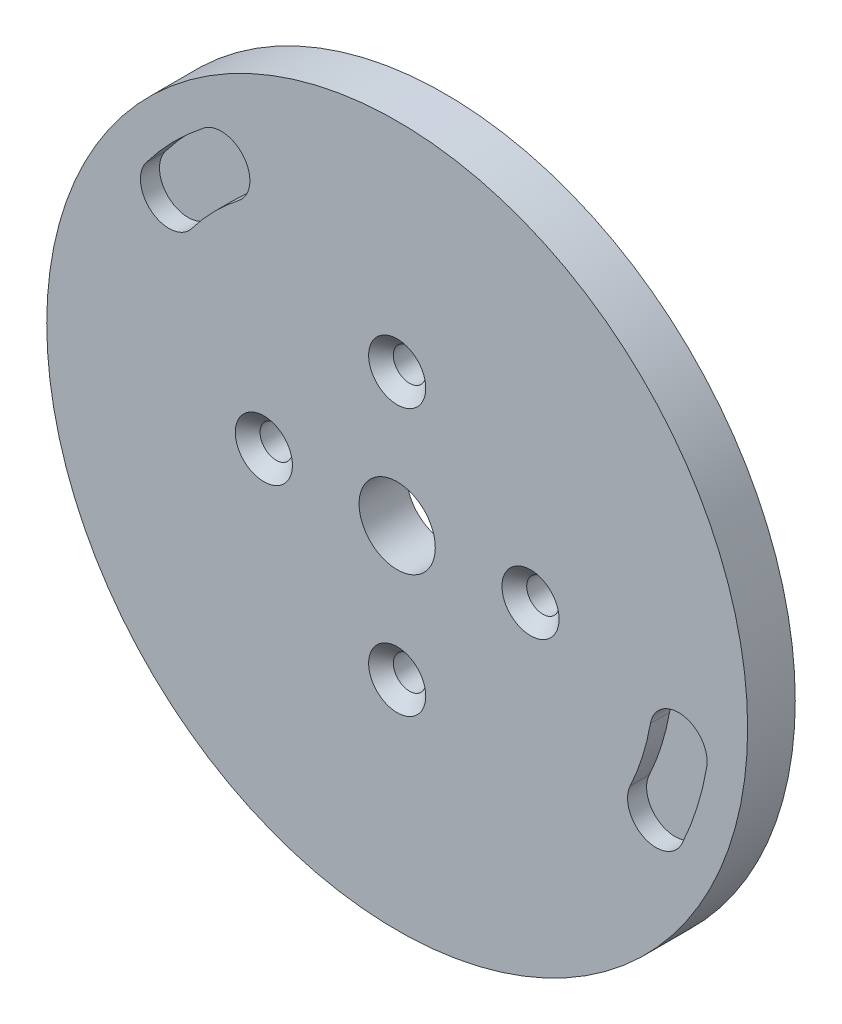
ISO-10303-21;
HEADER;
FILE_DESCRIPTION(('STEP AP214'),'2;1');
FILE_NAME('part.step','',(''),(''),'','','');
FILE_SCHEMA(('AUTOMOTIVE_DESIGN { 1 0 10303 214 1 1 1 1 }'));
ENDSEC;
DATA;
#1=APPLICATION_CONTEXT('core data for automotive mechanical design processes');
#2=APPLICATION_PROTOCOL_DEFINITION('international standard','automotive_design',2000,#1);
#3=PRODUCT_CONTEXT('',#1,'mechanical');
#4=PRODUCT('Part','Part','',(#3));
#5=PRODUCT_RELATED_PRODUCT_CATEGORY('part','',(#4));
#6=PRODUCT_DEFINITION_FORMATION('','',#4);
#7=PRODUCT_DEFINITION_CONTEXT('part definition',#1,'design');
#8=PRODUCT_DEFINITION('design','',#6,#7);
#9=PRODUCT_DEFINITION_SHAPE('','',#8);
#10=(LENGTH_UNIT() NAMED_UNIT(*) SI_UNIT(.MILLI.,.METRE.));
#11=(NAMED_UNIT(*) PLANE_ANGLE_UNIT() SI_UNIT($,.RADIAN.));
#12=(NAMED_UNIT(*) SI_UNIT($,.STERADIAN.) SOLID_ANGLE_UNIT());
#13=UNCERTAINTY_MEASURE_WITH_UNIT(LENGTH_MEASURE(1.E-05),#10,'distance_accuracy_value','');
#14=(GEOMETRIC_REPRESENTATION_CONTEXT(3) GLOBAL_UNCERTAINTY_ASSIGNED_CONTEXT((#13)) GLOBAL_UNIT_ASSIGNED_CONTEXT((#10,
#11,#12)) REPRESENTATION_CONTEXT('',''));
#15=CARTESIAN_POINT('',(0.,0.,0.));
#16=DIRECTION('',(0.,0.,1.));
#17=DIRECTION('',(1.,0.,0.));
#18=AXIS2_PLACEMENT_3D('',#15,#16,#17);
#19=CARTESIAN_POINT('',(0.,0.,5.));
#20=DIRECTION('',(0.,0.,1.));
#21=DIRECTION('',(1.,0.,0.));
#22=AXIS2_PLACEMENT_3D('',#19,#20,#21);
#23=PLANE('',#22);
#24=CARTESIAN_POINT('',(0.,14.,5.));
#25=DIRECTION('',(0.,0.,1.));
#26=DIRECTION('',(1.,0.,0.));
#27=AXIS2_PLACEMENT_3D('',#24,#25,#26);
#28=CIRCLE('',#27,3.);
#29=CARTESIAN_POINT('',(3.,14.,5.));
#30=VERTEX_POINT('',#29);
#31=EDGE_CURVE('E309',#30,#30,#28,.T.);
#32=ORIENTED_EDGE('',*,*,#31,.F.);
#33=EDGE_LOOP('',(#32));
#34=FACE_BOUND('',#33,.T.);
#35=CARTESIAN_POINT('',(14.,0.,5.));
#36=DIRECTION('',(0.,0.,1.));
#37=DIRECTION('',(1.,0.,0.));
#38=AXIS2_PLACEMENT_3D('',#35,#36,#37);
#39=CIRCLE('',#38,3.);
#40=CARTESIAN_POINT('',(17.,0.,5.));
#41=VERTEX_POINT('',#40);
#42=EDGE_CURVE('E237',#41,#41,#39,.T.);
#43=ORIENTED_EDGE('',*,*,#42,.F.);
#44=EDGE_LOOP('',(#43));
#45=FACE_BOUND('',#44,.T.);
#46=CARTESIAN_POINT('',(0.,-14.,5.));
#47=DIRECTION('',(0.,0.,1.));
#48=DIRECTION('',(1.,0.,0.));
#49=AXIS2_PLACEMENT_3D('',#46,#47,#48);
#50=CIRCLE('',#49,3.);
#51=CARTESIAN_POINT('',(3.,-14.,5.));
#52=VERTEX_POINT('',#51);
#53=EDGE_CURVE('E228',#52,#52,#50,.T.);
#54=ORIENTED_EDGE('',*,*,#53,.F.);
#55=EDGE_LOOP('',(#54));
#56=FACE_BOUND('',#55,.T.);
#57=CARTESIAN_POINT('',(-14.,0.,5.));
#58=DIRECTION('',(0.,0.,1.));
#59=DIRECTION('',(1.,0.,0.));
#60=AXIS2_PLACEMENT_3D('',#57,#58,#59);
#61=CIRCLE('',#60,3.);
#62=CARTESIAN_POINT('',(-11.,0.,5.));
#63=VERTEX_POINT('',#62);
#64=EDGE_CURVE('E223',#63,#63,#61,.T.);
#65=ORIENTED_EDGE('',*,*,#64,.F.);
#66=EDGE_LOOP('',(#65));
#67=FACE_BOUND('',#66,.T.);
#68=CARTESIAN_POINT('',(29.5442325903662,-5.20944533000793,5.));
#69=DIRECTION('',(0.,0.,1.));
#70=DIRECTION('',(1.,0.,0.));
#71=AXIS2_PLACEMENT_3D('',#68,#69,#70);
#72=CIRCLE('',#71,3.);
#73=CARTESIAN_POINT('',(32.4986558494029,-5.73038986300873,5.));
#74=VERTEX_POINT('',#73);
#75=CARTESIAN_POINT('',(26.5898093313296,-4.68850079700714,5.));
#76=VERTEX_POINT('',#75);
#77=EDGE_CURVE('E68',#74,#76,#72,.T.);
#78=ORIENTED_EDGE('',*,*,#77,.F.);
#79=CARTESIAN_POINT('',(0.,0.,5.));
#80=DIRECTION('',(0.,0.,1.));
#81=DIRECTION('',(1.,0.,0.));
#82=AXIS2_PLACEMENT_3D('',#79,#80,#81);
#83=CIRCLE('',#82,33.);
#84=CARTESIAN_POINT('',(29.9081569722092,-13.9464026374436,5.));
#85=VERTEX_POINT('',#84);
#86=EDGE_CURVE('E169',#85,#74,#83,.T.);
#87=ORIENTED_EDGE('',*,*,#86,.F.);
#88=CARTESIAN_POINT('',(27.1892336110993,-12.6785478522214,5.));
#89=DIRECTION('',(0.,0.,1.));
#90=DIRECTION('',(1.,0.,0.));
#91=AXIS2_PLACEMENT_3D('',#88,#89,#90);
#92=CIRCLE('',#91,3.);
#93=CARTESIAN_POINT('',(24.4703102499894,-11.4106930669993,5.));
#94=VERTEX_POINT('',#93);
#95=EDGE_CURVE('E188',#94,#85,#92,.T.);
#96=ORIENTED_EDGE('',*,*,#95,.F.);
#97=CARTESIAN_POINT('',(0.,0.,5.));
#98=DIRECTION('',(0.,0.,-1.));
#99=DIRECTION('',(1.,0.,0.));
#100=AXIS2_PLACEMENT_3D('',#97,#98,#99);
#101=CIRCLE('',#100,27.);
#102=EDGE_CURVE('E184',#76,#94,#101,.T.);
#103=ORIENTED_EDGE('',*,*,#102,.F.);
#104=EDGE_LOOP('',(#78,#87,#96,#103));
#105=FACE_BOUND('',#104,.T.);
#106=CARTESIAN_POINT('',(0.,0.,5.));
#107=DIRECTION('',(0.,0.,1.));
#108=DIRECTION('',(1.,0.,0.));
#109=AXIS2_PLACEMENT_3D('',#106,#107,#108);
#110=CIRCLE('',#109,4.);
#111=CARTESIAN_POINT('',(4.,0.,5.));
#112=VERTEX_POINT('',#111);
#113=EDGE_CURVE('E198',#112,#112,#110,.T.);
#114=ORIENTED_EDGE('',*,*,#113,.F.);
#115=EDGE_LOOP('',(#114));
#116=FACE_BOUND('',#115,.T.);
#117=CARTESIAN_POINT('',(0.,0.,5.));
#118=DIRECTION('',(0.,0.,1.));
#119=DIRECTION('',(1.,0.,0.));
#120=AXIS2_PLACEMENT_3D('',#117,#118,#119);
#121=CIRCLE('',#120,36.8);
#122=CARTESIAN_POINT('',(36.8,0.,5.));
#123=VERTEX_POINT('',#122);
#124=EDGE_CURVE('E11',#123,#123,#121,.T.);
#125=ORIENTED_EDGE('',*,*,#124,.T.);
#126=EDGE_LOOP('',(#125));
#127=FACE_BOUND('',#126,.T.);
#128=CARTESIAN_POINT('',(-23.959065301419,18.0544506945612,5.));
#129=DIRECTION('',(0.,0.,1.));
#130=DIRECTION('',(1.,0.,0.));
#131=AXIS2_PLACEMENT_3D('',#128,#129,#130);
#132=CIRCLE('',#131,3.);
#133=CARTESIAN_POINT('',(-26.3549718315609,19.8598957640173,5.));
#134=VERTEX_POINT('',#133);
#135=CARTESIAN_POINT('',(-21.5631587712771,16.2490056251051,5.));
#136=VERTEX_POINT('',#135);
#137=EDGE_CURVE('E60',#134,#136,#132,.T.);
#138=ORIENTED_EDGE('',*,*,#137,.F.);
#139=CARTESIAN_POINT('',(0.,0.,5.));
#140=DIRECTION('',(0.,0.,1.));
#141=DIRECTION('',(1.,0.,0.));
#142=AXIS2_PLACEMENT_3D('',#139,#140,#141);
#143=CIRCLE('',#142,33.);
#144=CARTESIAN_POINT('',(-20.3168286857469,26.0043548690217,5.));
#145=VERTEX_POINT('',#144);
#146=EDGE_CURVE('E133',#145,#134,#143,.T.);
#147=ORIENTED_EDGE('',*,*,#146,.F.);
#148=CARTESIAN_POINT('',(-18.4698442597699,23.6403226082016,5.));
#149=DIRECTION('',(0.,0.,1.));
#150=DIRECTION('',(1.,0.,0.));
#151=AXIS2_PLACEMENT_3D('',#148,#149,#150);
#152=CIRCLE('',#151,3.);
#153=CARTESIAN_POINT('',(-16.6228598337929,21.2762903473814,5.));
#154=VERTEX_POINT('',#153);
#155=EDGE_CURVE('E137',#154,#145,#152,.T.);
#156=ORIENTED_EDGE('',*,*,#155,.F.);
#157=CARTESIAN_POINT('',(0.,0.,5.));
#158=DIRECTION('',(0.,0.,-1.));
#159=DIRECTION('',(1.,0.,0.));
#160=AXIS2_PLACEMENT_3D('',#157,#158,#159);
#161=CIRCLE('',#160,27.);
#162=EDGE_CURVE('E149',#136,#154,#161,.T.);
#163=ORIENTED_EDGE('',*,*,#162,.F.);
#164=EDGE_LOOP('',(#138,#147,#156,#163));
#165=FACE_BOUND('',#164,.T.);
#166=ADVANCED_FACE('F42',(#34,#45,#56,#67,#105,#116,#127,#165),#23,.T.);
#167=CARTESIAN_POINT('',(0.,0.,5.));
#168=DIRECTION('',(0.,0.,-1.));
#169=DIRECTION('',(-1.,0.,0.));
#170=AXIS2_PLACEMENT_3D('',#167,#168,#169);
#171=CYLINDRICAL_SURFACE('',#170,36.8);
#172=ORIENTED_EDGE('',*,*,#124,.F.);
#173=EDGE_LOOP('',(#172));
#174=FACE_BOUND('',#173,.T.);
#175=CARTESIAN_POINT('',(0.,0.,0.));
#176=DIRECTION('',(0.,0.,1.));
#177=DIRECTION('',(1.,0.,0.));
#178=AXIS2_PLACEMENT_3D('',#175,#176,#177);
#179=CIRCLE('',#178,36.8);
#180=CARTESIAN_POINT('',(36.8,0.,0.));
#181=VERTEX_POINT('',#180);
#182=EDGE_CURVE('E52',#181,#181,#179,.T.);
#183=ORIENTED_EDGE('',*,*,#182,.T.);
#184=EDGE_LOOP('',(#183));
#185=FACE_BOUND('',#184,.T.);
#186=ADVANCED_FACE('F44',(#174,#185),#171,.T.);
#187=CARTESIAN_POINT('',(0.,0.,0.));
#188=DIRECTION('',(0.,0.,1.));
#189=DIRECTION('',(1.,0.,0.));
#190=AXIS2_PLACEMENT_3D('',#187,#188,#189);
#191=PLANE('',#190);
#192=CARTESIAN_POINT('',(0.,14.,0.));
#193=DIRECTION('',(0.,0.,1.));
#194=DIRECTION('',(1.,0.,0.));
#195=AXIS2_PLACEMENT_3D('',#192,#193,#194);
#196=CIRCLE('',#195,1.7);
#197=CARTESIAN_POINT('',(1.7,14.,0.));
#198=VERTEX_POINT('',#197);
#199=EDGE_CURVE('E46',#198,#198,#196,.T.);
#200=ORIENTED_EDGE('',*,*,#199,.T.);
#201=EDGE_LOOP('',(#200));
#202=FACE_BOUND('',#201,.T.);
#203=CARTESIAN_POINT('',(14.,0.,0.));
#204=DIRECTION('',(0.,0.,1.));
#205=DIRECTION('',(1.,0.,0.));
#206=AXIS2_PLACEMENT_3D('',#203,#204,#205);
#207=CIRCLE('',#206,1.7);
#208=CARTESIAN_POINT('',(15.7,0.,0.));
#209=VERTEX_POINT('',#208);
#210=EDGE_CURVE('E225',#209,#209,#207,.T.);
#211=ORIENTED_EDGE('',*,*,#210,.T.);
#212=EDGE_LOOP('',(#211));
#213=FACE_BOUND('',#212,.T.);
#214=CARTESIAN_POINT('',(0.,-14.,0.));
#215=DIRECTION('',(0.,0.,1.));
#216=DIRECTION('',(1.,0.,0.));
#217=AXIS2_PLACEMENT_3D('',#214,#215,#216);
#218=CIRCLE('',#217,1.7);
#219=CARTESIAN_POINT('',(1.7,-14.,0.));
#220=VERTEX_POINT('',#219);
#221=EDGE_CURVE('E220',#220,#220,#218,.T.);
#222=ORIENTED_EDGE('',*,*,#221,.T.);
#223=EDGE_LOOP('',(#222));
#224=FACE_BOUND('',#223,.T.);
#225=CARTESIAN_POINT('',(-14.,0.,0.));
#226=DIRECTION('',(0.,0.,1.));
#227=DIRECTION('',(1.,0.,0.));
#228=AXIS2_PLACEMENT_3D('',#225,#226,#227);
#229=CIRCLE('',#228,1.7);
#230=CARTESIAN_POINT('',(-12.3,0.,0.));
#231=VERTEX_POINT('',#230);
#232=EDGE_CURVE('E150',#231,#231,#229,.T.);
#233=ORIENTED_EDGE('',*,*,#232,.T.);
#234=EDGE_LOOP('',(#233));
#235=FACE_BOUND('',#234,.T.);
#236=CARTESIAN_POINT('',(0.,0.,0.));
#237=DIRECTION('',(0.,0.,1.));
#238=DIRECTION('',(1.,0.,0.));
#239=AXIS2_PLACEMENT_3D('',#236,#237,#238);
#240=CIRCLE('',#239,4.);
#241=CARTESIAN_POINT('',(4.,0.,0.));
#242=VERTEX_POINT('',#241);
#243=EDGE_CURVE('E210',#242,#242,#240,.F.);
#244=ORIENTED_EDGE('',*,*,#243,.F.);
#245=EDGE_LOOP('',(#244));
#246=FACE_BOUND('',#245,.T.);
#247=ORIENTED_EDGE('',*,*,#182,.F.);
#248=EDGE_LOOP('',(#247));
#249=FACE_BOUND('',#248,.T.);
#250=ADVANCED_FACE('F277',(#202,#213,#224,#235,#246,#249),#191,.F.);
#251=CARTESIAN_POINT('',(0.,0.,-0.00100000000000013));
#252=DIRECTION('',(0.,0.,1.));
#253=DIRECTION('',(1.,0.,0.));
#254=AXIS2_PLACEMENT_3D('',#251,#252,#253);
#255=CYLINDRICAL_SURFACE('',#254,4.);
#256=ORIENTED_EDGE('',*,*,#113,.T.);
#257=EDGE_LOOP('',(#256));
#258=FACE_BOUND('',#257,.T.);
#259=ORIENTED_EDGE('',*,*,#243,.T.);
#260=EDGE_LOOP('',(#259));
#261=FACE_BOUND('',#260,.T.);
#262=ADVANCED_FACE('F282',(#258,#261),#255,.F.);
#263=CARTESIAN_POINT('',(29.5442325903662,-5.20944533000793,3.));
#264=DIRECTION('',(0.,0.,1.));
#265=DIRECTION('',(1.,0.,0.));
#266=AXIS2_PLACEMENT_3D('',#263,#264,#265);
#267=CYLINDRICAL_SURFACE('',#266,3.);
#268=ORIENTED_EDGE('',*,*,#77,.T.);
#269=DIRECTION('',(0.,0.,1.));
#270=VECTOR('',#269,1.);
#271=CARTESIAN_POINT('',(26.5898093313296,-4.68850079700714,3.));
#272=LINE('',#271,#270);
#273=CARTESIAN_POINT('',(26.5898093313296,-4.68850079700714,3.));
#274=VERTEX_POINT('',#273);
#275=EDGE_CURVE('E181',#274,#76,#272,.T.);
#276=ORIENTED_EDGE('',*,*,#275,.F.);
#277=CARTESIAN_POINT('',(29.5442325903662,-5.20944533000793,3.));
#278=DIRECTION('',(0.,0.,1.));
#279=DIRECTION('',(1.,0.,0.));
#280=AXIS2_PLACEMENT_3D('',#277,#278,#279);
#281=CIRCLE('',#280,3.);
#282=CARTESIAN_POINT('',(32.4986558494029,-5.73038986300873,3.));
#283=VERTEX_POINT('',#282);
#284=EDGE_CURVE('E164',#283,#274,#281,.T.);
#285=ORIENTED_EDGE('',*,*,#284,.F.);
#286=DIRECTION('',(0.,0.,1.));
#287=VECTOR('',#286,1.);
#288=CARTESIAN_POINT('',(32.4986558494029,-5.73038986300873,3.));
#289=LINE('',#288,#287);
#290=EDGE_CURVE('E195',#283,#74,#289,.T.);
#291=ORIENTED_EDGE('',*,*,#290,.T.);
#292=EDGE_LOOP('',(#268,#276,#285,#291));
#293=FACE_BOUND('',#292,.T.);
#294=ADVANCED_FACE('F289',(#293),#267,.F.);
#295=CARTESIAN_POINT('',(0.,0.,3.));
#296=DIRECTION('',(0.,0.,1.));
#297=DIRECTION('',(1.,0.,0.));
#298=AXIS2_PLACEMENT_3D('',#295,#296,#297);
#299=CYLINDRICAL_SURFACE('',#298,33.);
#300=ORIENTED_EDGE('',*,*,#86,.T.);
#301=ORIENTED_EDGE('',*,*,#290,.F.);
#302=CARTESIAN_POINT('',(0.,0.,3.));
#303=DIRECTION('',(0.,0.,1.));
#304=DIRECTION('',(1.,0.,0.));
#305=AXIS2_PLACEMENT_3D('',#302,#303,#304);
#306=CIRCLE('',#305,33.);
#307=CARTESIAN_POINT('',(29.9081569722092,-13.9464026374436,3.));
#308=VERTEX_POINT('',#307);
#309=EDGE_CURVE('E177',#308,#283,#306,.T.);
#310=ORIENTED_EDGE('',*,*,#309,.F.);
#311=DIRECTION('',(0.,0.,1.));
#312=VECTOR('',#311,1.);
#313=CARTESIAN_POINT('',(29.9081569722092,-13.9464026374436,3.));
#314=LINE('',#313,#312);
#315=EDGE_CURVE('E199',#308,#85,#314,.T.);
#316=ORIENTED_EDGE('',*,*,#315,.T.);
#317=EDGE_LOOP('',(#300,#301,#310,#316));
#318=FACE_BOUND('',#317,.T.);
#319=ADVANCED_FACE('F373',(#318),#299,.F.);
#320=CARTESIAN_POINT('',(27.1892336110993,-12.6785478522214,3.));
#321=DIRECTION('',(0.,0.,1.));
#322=DIRECTION('',(1.,0.,0.));
#323=AXIS2_PLACEMENT_3D('',#320,#321,#322);
#324=CYLINDRICAL_SURFACE('',#323,3.);
#325=ORIENTED_EDGE('',*,*,#95,.T.);
#326=ORIENTED_EDGE('',*,*,#315,.F.);
#327=CARTESIAN_POINT('',(27.1892336110993,-12.6785478522214,3.));
#328=DIRECTION('',(0.,0.,1.));
#329=DIRECTION('',(1.,0.,0.));
#330=AXIS2_PLACEMENT_3D('',#327,#328,#329);
#331=CIRCLE('',#330,3.);
#332=CARTESIAN_POINT('',(24.4703102499894,-11.4106930669993,3.));
#333=VERTEX_POINT('',#332);
#334=EDGE_CURVE('E173',#333,#308,#331,.T.);
#335=ORIENTED_EDGE('',*,*,#334,.F.);
#336=DIRECTION('',(0.,0.,1.));
#337=VECTOR('',#336,1.);
#338=CARTESIAN_POINT('',(24.4703102499894,-11.4106930669993,3.));
#339=LINE('',#338,#337);
#340=EDGE_CURVE('E202',#333,#94,#339,.T.);
#341=ORIENTED_EDGE('',*,*,#340,.T.);
#342=EDGE_LOOP('',(#325,#326,#335,#341));
#343=FACE_BOUND('',#342,.T.);
#344=ADVANCED_FACE('F376',(#343),#324,.F.);
#345=CARTESIAN_POINT('',(0.,0.,3.));
#346=DIRECTION('',(0.,0.,1.));
#347=DIRECTION('',(1.,0.,0.));
#348=AXIS2_PLACEMENT_3D('',#345,#346,#347);
#349=CYLINDRICAL_SURFACE('',#348,27.);
#350=ORIENTED_EDGE('',*,*,#102,.T.);
#351=ORIENTED_EDGE('',*,*,#340,.F.);
#352=CARTESIAN_POINT('',(0.,0.,3.));
#353=DIRECTION('',(0.,0.,-1.));
#354=DIRECTION('',(1.,0.,0.));
#355=AXIS2_PLACEMENT_3D('',#352,#353,#354);
#356=CIRCLE('',#355,27.);
#357=EDGE_CURVE('E168',#274,#333,#356,.T.);
#358=ORIENTED_EDGE('',*,*,#357,.F.);
#359=ORIENTED_EDGE('',*,*,#275,.T.);
#360=EDGE_LOOP('',(#350,#351,#358,#359));
#361=FACE_BOUND('',#360,.T.);
#362=ADVANCED_FACE('F371',(#361),#349,.T.);
#363=CARTESIAN_POINT('',(14.7721162951831,-2.60472266500397,3.));
#364=DIRECTION('',(0.,0.,1.));
#365=DIRECTION('',(1.,0.,0.));
#366=AXIS2_PLACEMENT_3D('',#363,#364,#365);
#367=PLANE('',#366);
#368=ORIENTED_EDGE('',*,*,#284,.T.);
#369=ORIENTED_EDGE('',*,*,#357,.T.);
#370=ORIENTED_EDGE('',*,*,#334,.T.);
#371=ORIENTED_EDGE('',*,*,#309,.T.);
#372=EDGE_LOOP('',(#368,#369,#370,#371));
#373=FACE_BOUND('',#372,.T.);
#374=ADVANCED_FACE('F363',(#373),#367,.T.);
#375=CARTESIAN_POINT('',(-23.959065301419,18.0544506945612,3.));
#376=DIRECTION('',(0.,0.,1.));
#377=DIRECTION('',(1.,0.,0.));
#378=AXIS2_PLACEMENT_3D('',#375,#376,#377);
#379=CYLINDRICAL_SURFACE('',#378,3.);
#380=ORIENTED_EDGE('',*,*,#137,.T.);
#381=DIRECTION('',(0.,0.,1.));
#382=VECTOR('',#381,1.);
#383=CARTESIAN_POINT('',(-21.5631587712771,16.2490056251051,3.));
#384=LINE('',#383,#382);
#385=CARTESIAN_POINT('',(-21.5631587712771,16.2490056251051,3.));
#386=VERTEX_POINT('',#385);
#387=EDGE_CURVE('E108',#386,#136,#384,.T.);
#388=ORIENTED_EDGE('',*,*,#387,.F.);
#389=CARTESIAN_POINT('',(-23.959065301419,18.0544506945612,3.));
#390=DIRECTION('',(0.,0.,1.));
#391=DIRECTION('',(1.,0.,0.));
#392=AXIS2_PLACEMENT_3D('',#389,#390,#391);
#393=CIRCLE('',#392,3.);
#394=CARTESIAN_POINT('',(-26.3549718315609,19.8598957640173,3.));
#395=VERTEX_POINT('',#394);
#396=EDGE_CURVE('E112',#395,#386,#393,.T.);
#397=ORIENTED_EDGE('',*,*,#396,.F.);
#398=DIRECTION('',(0.,0.,1.));
#399=VECTOR('',#398,1.);
#400=CARTESIAN_POINT('',(-26.3549718315609,19.8598957640173,3.));
#401=LINE('',#400,#399);
#402=EDGE_CURVE('E156',#395,#134,#401,.T.);
#403=ORIENTED_EDGE('',*,*,#402,.T.);
#404=EDGE_LOOP('',(#380,#388,#397,#403));
#405=FACE_BOUND('',#404,.T.);
#406=ADVANCED_FACE('F110',(#405),#379,.F.);
#407=CARTESIAN_POINT('',(0.,0.,3.));
#408=DIRECTION('',(0.,0.,1.));
#409=DIRECTION('',(1.,0.,0.));
#410=AXIS2_PLACEMENT_3D('',#407,#408,#409);
#411=CYLINDRICAL_SURFACE('',#410,33.);
#412=ORIENTED_EDGE('',*,*,#146,.T.);
#413=ORIENTED_EDGE('',*,*,#402,.F.);
#414=CARTESIAN_POINT('',(0.,0.,3.));
#415=DIRECTION('',(0.,0.,1.));
#416=DIRECTION('',(1.,0.,0.));
#417=AXIS2_PLACEMENT_3D('',#414,#415,#416);
#418=CIRCLE('',#417,33.);
#419=CARTESIAN_POINT('',(-20.3168286857469,26.0043548690217,3.));
#420=VERTEX_POINT('',#419);
#421=EDGE_CURVE('E119',#420,#395,#418,.T.);
#422=ORIENTED_EDGE('',*,*,#421,.F.);
#423=DIRECTION('',(0.,0.,1.));
#424=VECTOR('',#423,1.);
#425=CARTESIAN_POINT('',(-20.3168286857469,26.0043548690217,3.));
#426=LINE('',#425,#424);
#427=EDGE_CURVE('E159',#420,#145,#426,.T.);
#428=ORIENTED_EDGE('',*,*,#427,.T.);
#429=EDGE_LOOP('',(#412,#413,#422,#428));
#430=FACE_BOUND('',#429,.T.);
#431=ADVANCED_FACE('F355',(#430),#411,.F.);
#432=CARTESIAN_POINT('',(-18.4698442597699,23.6403226082016,3.));
#433=DIRECTION('',(0.,0.,1.));
#434=DIRECTION('',(1.,0.,0.));
#435=AXIS2_PLACEMENT_3D('',#432,#433,#434);
#436=CYLINDRICAL_SURFACE('',#435,3.);
#437=ORIENTED_EDGE('',*,*,#155,.T.);
#438=ORIENTED_EDGE('',*,*,#427,.F.);
#439=CARTESIAN_POINT('',(-18.4698442597699,23.6403226082016,3.));
#440=DIRECTION('',(0.,0.,1.));
#441=DIRECTION('',(1.,0.,0.));
#442=AXIS2_PLACEMENT_3D('',#439,#440,#441);
#443=CIRCLE('',#442,3.);
#444=CARTESIAN_POINT('',(-16.6228598337929,21.2762903473814,3.));
#445=VERTEX_POINT('',#444);
#446=EDGE_CURVE('E128',#445,#420,#443,.T.);
#447=ORIENTED_EDGE('',*,*,#446,.F.);
#448=DIRECTION('',(0.,0.,1.));
#449=VECTOR('',#448,1.);
#450=CARTESIAN_POINT('',(-16.6228598337929,21.2762903473814,3.));
#451=LINE('',#450,#449);
#452=EDGE_CURVE('E118',#445,#154,#451,.T.);
#453=ORIENTED_EDGE('',*,*,#452,.T.);
#454=EDGE_LOOP('',(#437,#438,#447,#453));
#455=FACE_BOUND('',#454,.T.);
#456=ADVANCED_FACE('F353',(#455),#436,.F.);
#457=CARTESIAN_POINT('',(0.,0.,3.));
#458=DIRECTION('',(0.,0.,1.));
#459=DIRECTION('',(1.,0.,0.));
#460=AXIS2_PLACEMENT_3D('',#457,#458,#459);
#461=CYLINDRICAL_SURFACE('',#460,27.);
#462=ORIENTED_EDGE('',*,*,#162,.T.);
#463=ORIENTED_EDGE('',*,*,#452,.F.);
#464=CARTESIAN_POINT('',(0.,0.,3.));
#465=DIRECTION('',(0.,0.,-1.));
#466=DIRECTION('',(1.,0.,0.));
#467=AXIS2_PLACEMENT_3D('',#464,#465,#466);
#468=CIRCLE('',#467,27.);
#469=EDGE_CURVE('E122',#386,#445,#468,.T.);
#470=ORIENTED_EDGE('',*,*,#469,.F.);
#471=ORIENTED_EDGE('',*,*,#387,.T.);
#472=EDGE_LOOP('',(#462,#463,#470,#471));
#473=FACE_BOUND('',#472,.T.);
#474=ADVANCED_FACE('F123',(#473),#461,.T.);
#475=CARTESIAN_POINT('',(-11.9795326507095,9.02722534728061,3.));
#476=DIRECTION('',(0.,0.,1.));
#477=DIRECTION('',(1.,0.,0.));
#478=AXIS2_PLACEMENT_3D('',#475,#476,#477);
#479=PLANE('',#478);
#480=ORIENTED_EDGE('',*,*,#396,.T.);
#481=ORIENTED_EDGE('',*,*,#469,.T.);
#482=ORIENTED_EDGE('',*,*,#446,.T.);
#483=ORIENTED_EDGE('',*,*,#421,.T.);
#484=EDGE_LOOP('',(#480,#481,#482,#483));
#485=FACE_BOUND('',#484,.T.);
#486=ADVANCED_FACE('F130',(#485),#479,.T.);
#487=CARTESIAN_POINT('',(-14.,0.,5.));
#488=DIRECTION('',(0.,0.,1.));
#489=DIRECTION('',(1.,0.,0.));
#490=AXIS2_PLACEMENT_3D('',#487,#488,#489);
#491=CYLINDRICAL_SURFACE('',#490,1.7);
#492=CARTESIAN_POINT('',(-14.,0.,3.7));
#493=DIRECTION('',(0.,0.,1.));
#494=DIRECTION('',(1.,0.,0.));
#495=AXIS2_PLACEMENT_3D('',#492,#493,#494);
#496=CIRCLE('',#495,1.7);
#497=CARTESIAN_POINT('',(-12.3,0.,3.7));
#498=VERTEX_POINT('',#497);
#499=EDGE_CURVE('E140',#498,#498,#496,.T.);
#500=ORIENTED_EDGE('',*,*,#499,.T.);
#501=EDGE_LOOP('',(#500));
#502=FACE_BOUND('',#501,.T.);
#503=ORIENTED_EDGE('',*,*,#232,.F.);
#504=EDGE_LOOP('',(#503));
#505=FACE_BOUND('',#504,.T.);
#506=ADVANCED_FACE('F256',(#502,#505),#491,.F.);
#507=CARTESIAN_POINT('',(-14.,0.,5.));
#508=DIRECTION('',(0.,0.,1.));
#509=DIRECTION('',(1.,0.,0.));
#510=AXIS2_PLACEMENT_3D('',#507,#508,#509);
#511=CONICAL_SURFACE('',#510,3.,0.785398163397448);
#512=ORIENTED_EDGE('',*,*,#499,.F.);
#513=EDGE_LOOP('',(#512));
#514=FACE_BOUND('',#513,.T.);
#515=ORIENTED_EDGE('',*,*,#64,.T.);
#516=EDGE_LOOP('',(#515));
#517=FACE_BOUND('',#516,.T.);
#518=ADVANCED_FACE('F259',(#514,#517),#511,.F.);
#519=CARTESIAN_POINT('',(0.,-14.,5.));
#520=DIRECTION('',(0.,0.,1.));
#521=DIRECTION('',(1.,0.,0.));
#522=AXIS2_PLACEMENT_3D('',#519,#520,#521);
#523=CYLINDRICAL_SURFACE('',#522,1.7);
#524=CARTESIAN_POINT('',(0.,-14.,3.7));
#525=DIRECTION('',(0.,0.,1.));
#526=DIRECTION('',(1.,0.,0.));
#527=AXIS2_PLACEMENT_3D('',#524,#525,#526);
#528=CIRCLE('',#527,1.7);
#529=CARTESIAN_POINT('',(1.7,-14.,3.7));
#530=VERTEX_POINT('',#529);
#531=EDGE_CURVE('E224',#530,#530,#528,.T.);
#532=ORIENTED_EDGE('',*,*,#531,.T.);
#533=EDGE_LOOP('',(#532));
#534=FACE_BOUND('',#533,.T.);
#535=ORIENTED_EDGE('',*,*,#221,.F.);
#536=EDGE_LOOP('',(#535));
#537=FACE_BOUND('',#536,.T.);
#538=ADVANCED_FACE('F261',(#534,#537),#523,.F.);
#539=CARTESIAN_POINT('',(0.,-14.,5.));
#540=DIRECTION('',(0.,0.,1.));
#541=DIRECTION('',(1.,0.,0.));
#542=AXIS2_PLACEMENT_3D('',#539,#540,#541);
#543=CONICAL_SURFACE('',#542,3.,0.785398163397448);
#544=ORIENTED_EDGE('',*,*,#531,.F.);
#545=EDGE_LOOP('',(#544));
#546=FACE_BOUND('',#545,.T.);
#547=ORIENTED_EDGE('',*,*,#53,.T.);
#548=EDGE_LOOP('',(#547));
#549=FACE_BOUND('',#548,.T.);
#550=ADVANCED_FACE('F267',(#546,#549),#543,.F.);
#551=CARTESIAN_POINT('',(14.,0.,5.));
#552=DIRECTION('',(0.,0.,1.));
#553=DIRECTION('',(1.,0.,0.));
#554=AXIS2_PLACEMENT_3D('',#551,#552,#553);
#555=CYLINDRICAL_SURFACE('',#554,1.7);
#556=CARTESIAN_POINT('',(14.,0.,3.7));
#557=DIRECTION('',(0.,0.,1.));
#558=DIRECTION('',(1.,0.,0.));
#559=AXIS2_PLACEMENT_3D('',#556,#557,#558);
#560=CIRCLE('',#559,1.7);
#561=CARTESIAN_POINT('',(15.7,0.,3.7));
#562=VERTEX_POINT('',#561);
#563=EDGE_CURVE('E229',#562,#562,#560,.T.);
#564=ORIENTED_EDGE('',*,*,#563,.T.);
#565=EDGE_LOOP('',(#564));
#566=FACE_BOUND('',#565,.T.);
#567=ORIENTED_EDGE('',*,*,#210,.F.);
#568=EDGE_LOOP('',(#567));
#569=FACE_BOUND('',#568,.T.);
#570=ADVANCED_FACE('F329',(#566,#569),#555,.F.);
#571=CARTESIAN_POINT('',(14.,0.,5.));
#572=DIRECTION('',(0.,0.,1.));
#573=DIRECTION('',(1.,0.,0.));
#574=AXIS2_PLACEMENT_3D('',#571,#572,#573);
#575=CONICAL_SURFACE('',#574,3.,0.785398163397448);
#576=ORIENTED_EDGE('',*,*,#563,.F.);
#577=EDGE_LOOP('',(#576));
#578=FACE_BOUND('',#577,.T.);
#579=ORIENTED_EDGE('',*,*,#42,.T.);
#580=EDGE_LOOP('',(#579));
#581=FACE_BOUND('',#580,.T.);
#582=ADVANCED_FACE('F324',(#578,#581),#575,.F.);
#583=CARTESIAN_POINT('',(0.,14.,5.));
#584=DIRECTION('',(0.,0.,1.));
#585=DIRECTION('',(1.,0.,0.));
#586=AXIS2_PLACEMENT_3D('',#583,#584,#585);
#587=CYLINDRICAL_SURFACE('',#586,1.7);
#588=CARTESIAN_POINT('',(0.,14.,3.7));
#589=DIRECTION('',(0.,0.,1.));
#590=DIRECTION('',(1.,0.,0.));
#591=AXIS2_PLACEMENT_3D('',#588,#589,#590);
#592=CIRCLE('',#591,1.7);
#593=CARTESIAN_POINT('',(1.7,14.,3.7));
#594=VERTEX_POINT('',#593);
#595=EDGE_CURVE('E306',#594,#594,#592,.T.);
#596=ORIENTED_EDGE('',*,*,#595,.T.);
#597=EDGE_LOOP('',(#596));
#598=FACE_BOUND('',#597,.T.);
#599=ORIENTED_EDGE('',*,*,#199,.F.);
#600=EDGE_LOOP('',(#599));
#601=FACE_BOUND('',#600,.T.);
#602=ADVANCED_FACE('F318',(#598,#601),#587,.F.);
#603=CARTESIAN_POINT('',(0.,14.,5.));
#604=DIRECTION('',(0.,0.,1.));
#605=DIRECTION('',(1.,0.,0.));
#606=AXIS2_PLACEMENT_3D('',#603,#604,#605);
#607=CONICAL_SURFACE('',#606,3.,0.785398163397448);
#608=ORIENTED_EDGE('',*,*,#595,.F.);
#609=EDGE_LOOP('',(#608));
#610=FACE_BOUND('',#609,.T.);
#611=ORIENTED_EDGE('',*,*,#31,.T.);
#612=EDGE_LOOP('',(#611));
#613=FACE_BOUND('',#612,.T.);
#614=ADVANCED_FACE('F316',(#610,#613),#607,.F.);
#615=CLOSED_SHELL('',(#166,#186,#250,#262,#294,#319,#344,#362,#374,#406,#431,#456,#474,#486,
#506,#518,#538,#550,#570,#582,#602,#614));
#616=MANIFOLD_SOLID_BREP('B2',#615);
#617=ADVANCED_BREP_SHAPE_REPRESENTATION('',(#18,#616),#14);
#618=SHAPE_DEFINITION_REPRESENTATION(#9,#617);
ENDSEC;
END-ISO-10303-21;
